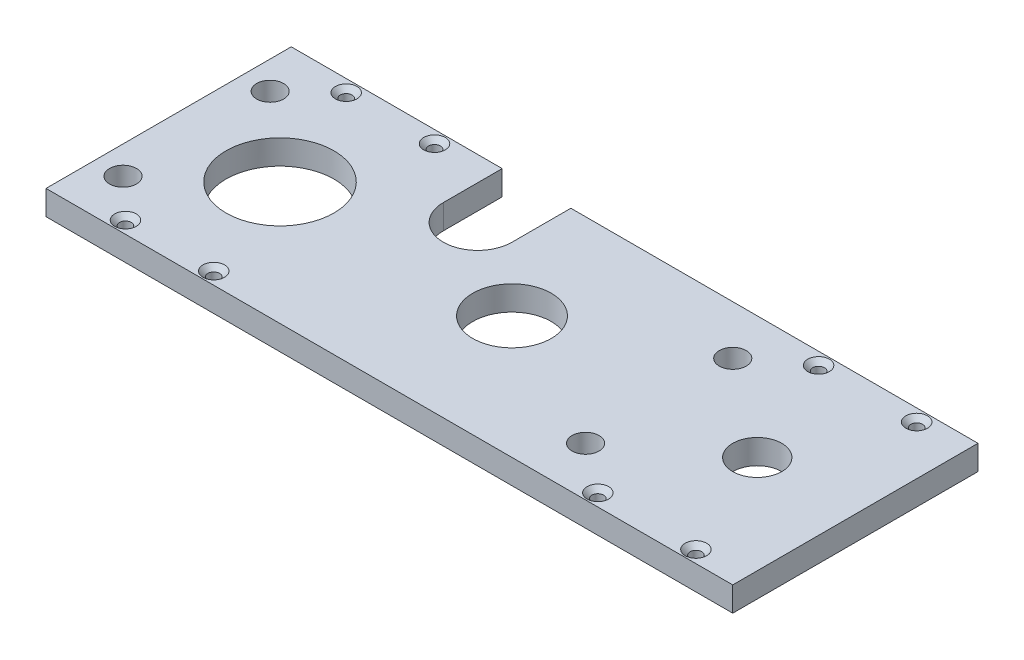
ISO-10303-21;
HEADER;
FILE_DESCRIPTION(('STEP AP214'),'2;1');
FILE_NAME('part.step','',(''),(''),'','','');
FILE_SCHEMA(('AUTOMOTIVE_DESIGN { 1 0 10303 214 1 1 1 1 }'));
ENDSEC;
DATA;
#1=APPLICATION_CONTEXT('core data for automotive mechanical design processes');
#2=APPLICATION_PROTOCOL_DEFINITION('international standard','automotive_design',2000,#1);
#3=PRODUCT_CONTEXT('',#1,'mechanical');
#4=PRODUCT('Part','Part','',(#3));
#5=PRODUCT_RELATED_PRODUCT_CATEGORY('part','',(#4));
#6=PRODUCT_DEFINITION_FORMATION('','',#4);
#7=PRODUCT_DEFINITION_CONTEXT('part definition',#1,'design');
#8=PRODUCT_DEFINITION('design','',#6,#7);
#9=PRODUCT_DEFINITION_SHAPE('','',#8);
#10=(LENGTH_UNIT() NAMED_UNIT(*) SI_UNIT(.MILLI.,.METRE.));
#11=(NAMED_UNIT(*) PLANE_ANGLE_UNIT() SI_UNIT($,.RADIAN.));
#12=(NAMED_UNIT(*) SI_UNIT($,.STERADIAN.) SOLID_ANGLE_UNIT());
#13=UNCERTAINTY_MEASURE_WITH_UNIT(LENGTH_MEASURE(1.E-05),#10,'distance_accuracy_value','');
#14=(GEOMETRIC_REPRESENTATION_CONTEXT(3) GLOBAL_UNCERTAINTY_ASSIGNED_CONTEXT((#13)) GLOBAL_UNIT_ASSIGNED_CONTEXT((#10,
#11,#12)) REPRESENTATION_CONTEXT('',''));
#15=CARTESIAN_POINT('',(0.,0.,0.));
#16=DIRECTION('',(0.,0.,1.));
#17=DIRECTION('',(1.,0.,0.));
#18=AXIS2_PLACEMENT_3D('',#15,#16,#17);
#19=CARTESIAN_POINT('',(-103.501932742673,5.,-25.));
#20=DIRECTION('',(0.,0.,1.));
#21=DIRECTION('',(1.,0.,0.));
#22=AXIS2_PLACEMENT_3D('',#19,#20,#21);
#23=PLANE('',#22);
#24=DIRECTION('',(-1.,0.,0.));
#25=VECTOR('',#24,1.);
#26=CARTESIAN_POINT('',(-103.501932742673,0.,-25.));
#27=LINE('',#26,#25);
#28=CARTESIAN_POINT('',(36.4980672573274,0.,-25.));
#29=VERTEX_POINT('',#28);
#30=CARTESIAN_POINT('',(-46.5019327426726,0.,-25.));
#31=VERTEX_POINT('',#30);
#32=EDGE_CURVE('E310',#29,#31,#27,.T.);
#33=ORIENTED_EDGE('',*,*,#32,.T.);
#34=DIRECTION('',(0.,-1.,0.));
#35=VECTOR('',#34,1.);
#36=CARTESIAN_POINT('',(-46.5019327426726,5.,-25.));
#37=LINE('',#36,#35);
#38=CARTESIAN_POINT('',(-46.5019327426726,5.,-25.));
#39=VERTEX_POINT('',#38);
#40=EDGE_CURVE('E150',#39,#31,#37,.T.);
#41=ORIENTED_EDGE('',*,*,#40,.F.);
#42=DIRECTION('',(-1.,0.,0.));
#43=VECTOR('',#42,1.);
#44=CARTESIAN_POINT('',(-103.501932742673,5.,-25.));
#45=LINE('',#44,#43);
#46=CARTESIAN_POINT('',(36.4980672573274,5.,-25.));
#47=VERTEX_POINT('',#46);
#48=EDGE_CURVE('E316',#47,#39,#45,.T.);
#49=ORIENTED_EDGE('',*,*,#48,.F.);
#50=DIRECTION('',(0.,-1.,0.));
#51=VECTOR('',#50,1.);
#52=CARTESIAN_POINT('',(36.4980672573274,5.,-25.));
#53=LINE('',#52,#51);
#54=EDGE_CURVE('E334',#47,#29,#53,.T.);
#55=ORIENTED_EDGE('',*,*,#54,.T.);
#56=EDGE_LOOP('',(#33,#41,#49,#55));
#57=FACE_BOUND('',#56,.T.);
#58=ADVANCED_FACE('F39',(#57),#23,.F.);
#59=CARTESIAN_POINT('',(0.,5.,0.));
#60=DIRECTION('',(0.,-1.,0.));
#61=DIRECTION('',(0.,0.,-1.));
#62=AXIS2_PLACEMENT_3D('',#59,#60,#61);
#63=PLANE('',#62);
#64=CARTESIAN_POINT('',(-97.8019327426726,5.,-15.));
#65=DIRECTION('',(0.,-1.,0.));
#66=DIRECTION('',(0.,0.,-1.));
#67=AXIS2_PLACEMENT_3D('',#64,#65,#66);
#68=CIRCLE('',#67,2.75);
#69=CARTESIAN_POINT('',(-97.8019327426726,5.,-17.75));
#70=VERTEX_POINT('',#69);
#71=EDGE_CURVE('E158',#70,#70,#68,.T.);
#72=ORIENTED_EDGE('',*,*,#71,.T.);
#73=EDGE_LOOP('',(#72));
#74=FACE_BOUND('',#73,.T.);
#75=CARTESIAN_POINT('',(-97.8019327426726,5.,15.));
#76=DIRECTION('',(0.,-1.,0.));
#77=DIRECTION('',(0.,0.,-1.));
#78=AXIS2_PLACEMENT_3D('',#75,#76,#77);
#79=CIRCLE('',#78,2.75);
#80=CARTESIAN_POINT('',(-97.8019327426726,5.,12.25));
#81=VERTEX_POINT('',#80);
#82=EDGE_CURVE('E166',#81,#81,#79,.T.);
#83=ORIENTED_EDGE('',*,*,#82,.T.);
#84=EDGE_LOOP('',(#83));
#85=FACE_BOUND('',#84,.T.);
#86=CARTESIAN_POINT('',(-3.50193274267263,5.,15.));
#87=DIRECTION('',(0.,-1.,0.));
#88=DIRECTION('',(0.,0.,-1.));
#89=AXIS2_PLACEMENT_3D('',#86,#87,#88);
#90=CIRCLE('',#89,2.75);
#91=CARTESIAN_POINT('',(-3.50193274267263,5.,12.25));
#92=VERTEX_POINT('',#91);
#93=EDGE_CURVE('E174',#92,#92,#90,.T.);
#94=ORIENTED_EDGE('',*,*,#93,.T.);
#95=EDGE_LOOP('',(#94));
#96=FACE_BOUND('',#95,.T.);
#97=CARTESIAN_POINT('',(-3.50193274267265,5.,-15.));
#98=DIRECTION('',(0.,-1.,0.));
#99=DIRECTION('',(0.,0.,-1.));
#100=AXIS2_PLACEMENT_3D('',#97,#98,#99);
#101=CIRCLE('',#100,2.75);
#102=CARTESIAN_POINT('',(-3.50193274267265,5.,-17.75));
#103=VERTEX_POINT('',#102);
#104=EDGE_CURVE('E182',#103,#103,#101,.T.);
#105=ORIENTED_EDGE('',*,*,#104,.T.);
#106=EDGE_LOOP('',(#105));
#107=FACE_BOUND('',#106,.T.);
#108=CARTESIAN_POINT('',(-71.8019327426726,5.,-22.5));
#109=DIRECTION('',(0.,1.,0.));
#110=DIRECTION('',(0.,0.,1.));
#111=AXIS2_PLACEMENT_3D('',#108,#109,#110);
#112=CIRCLE('',#111,2.19999999999999);
#113=CARTESIAN_POINT('',(-71.8019327426726,5.,-20.3));
#114=VERTEX_POINT('',#113);
#115=EDGE_CURVE('E198',#114,#114,#112,.T.);
#116=ORIENTED_EDGE('',*,*,#115,.F.);
#117=EDGE_LOOP('',(#116));
#118=FACE_BOUND('',#117,.T.);
#119=CARTESIAN_POINT('',(6.49806725732737,5.,22.5));
#120=DIRECTION('',(0.,1.,0.));
#121=DIRECTION('',(0.,0.,1.));
#122=AXIS2_PLACEMENT_3D('',#119,#120,#121);
#123=CIRCLE('',#122,2.2);
#124=CARTESIAN_POINT('',(6.49806725732737,5.,24.7));
#125=VERTEX_POINT('',#124);
#126=EDGE_CURVE('E258',#125,#125,#123,.T.);
#127=ORIENTED_EDGE('',*,*,#126,.F.);
#128=EDGE_LOOP('',(#127));
#129=FACE_BOUND('',#128,.T.);
#130=CARTESIAN_POINT('',(-80.8019327426726,5.,0.));
#131=DIRECTION('',(0.,1.,0.));
#132=DIRECTION('',(0.,0.,1.));
#133=AXIS2_PLACEMENT_3D('',#130,#131,#132);
#134=CIRCLE('',#133,11.);
#135=CARTESIAN_POINT('',(-80.8019327426726,5.,11.));
#136=VERTEX_POINT('',#135);
#137=EDGE_CURVE('E283',#136,#136,#134,.T.);
#138=ORIENTED_EDGE('',*,*,#137,.F.);
#139=EDGE_LOOP('',(#138));
#140=FACE_BOUND('',#139,.T.);
#141=CARTESIAN_POINT('',(-33.5019327426726,5.,0.));
#142=DIRECTION('',(0.,-1.,0.));
#143=DIRECTION('',(0.,0.,-1.));
#144=AXIS2_PLACEMENT_3D('',#141,#142,#143);
#145=CIRCLE('',#144,8.);
#146=CARTESIAN_POINT('',(-33.5019327426726,5.,-8.));
#147=VERTEX_POINT('',#146);
#148=EDGE_CURVE('E294',#147,#147,#145,.F.);
#149=ORIENTED_EDGE('',*,*,#148,.F.);
#150=EDGE_LOOP('',(#149));
#151=FACE_BOUND('',#150,.T.);
#152=ORIENTED_EDGE('',*,*,#48,.T.);
#153=DIRECTION('',(0.,0.,1.));
#154=VECTOR('',#153,1.);
#155=CARTESIAN_POINT('',(-46.5019327426726,5.,-13.));
#156=LINE('',#155,#154);
#157=CARTESIAN_POINT('',(-46.5019327426726,5.,-13.));
#158=VERTEX_POINT('',#157);
#159=EDGE_CURVE('E124',#39,#158,#156,.T.);
#160=ORIENTED_EDGE('',*,*,#159,.T.);
#161=CARTESIAN_POINT('',(-53.5019327426726,5.,-13.));
#162=DIRECTION('',(0.,-1.,0.));
#163=DIRECTION('',(0.,0.,-1.));
#164=AXIS2_PLACEMENT_3D('',#161,#162,#163);
#165=CIRCLE('',#164,7.);
#166=CARTESIAN_POINT('',(-60.5019327426726,5.,-13.));
#167=VERTEX_POINT('',#166);
#168=EDGE_CURVE('E118',#158,#167,#165,.T.);
#169=ORIENTED_EDGE('',*,*,#168,.T.);
#170=DIRECTION('',(0.,0.,-1.));
#171=VECTOR('',#170,1.);
#172=CARTESIAN_POINT('',(-60.5019327426726,5.,-13.));
#173=LINE('',#172,#171);
#174=CARTESIAN_POINT('',(-60.5019327426726,5.,-25.));
#175=VERTEX_POINT('',#174);
#176=EDGE_CURVE('E126',#167,#175,#173,.T.);
#177=ORIENTED_EDGE('',*,*,#176,.T.);
#178=CARTESIAN_POINT('',(-103.501932742673,5.,-25.));
#179=VERTEX_POINT('',#178);
#180=EDGE_CURVE('E64',#175,#179,#45,.T.);
#181=ORIENTED_EDGE('',*,*,#180,.T.);
#182=DIRECTION('',(0.,0.,1.));
#183=VECTOR('',#182,1.);
#184=CARTESIAN_POINT('',(-103.501932742673,5.,25.));
#185=LINE('',#184,#183);
#186=CARTESIAN_POINT('',(-103.501932742673,5.,25.));
#187=VERTEX_POINT('',#186);
#188=EDGE_CURVE('E307',#179,#187,#185,.T.);
#189=ORIENTED_EDGE('',*,*,#188,.T.);
#190=DIRECTION('',(1.,0.,0.));
#191=VECTOR('',#190,1.);
#192=CARTESIAN_POINT('',(36.4980672573274,5.,25.));
#193=LINE('',#192,#191);
#194=CARTESIAN_POINT('',(36.4980672573274,5.,25.));
#195=VERTEX_POINT('',#194);
#196=EDGE_CURVE('E92',#187,#195,#193,.T.);
#197=ORIENTED_EDGE('',*,*,#196,.T.);
#198=DIRECTION('',(0.,0.,-1.));
#199=VECTOR('',#198,1.);
#200=CARTESIAN_POINT('',(36.4980672573274,5.,25.));
#201=LINE('',#200,#199);
#202=EDGE_CURVE('E313',#195,#47,#201,.T.);
#203=ORIENTED_EDGE('',*,*,#202,.T.);
#204=EDGE_LOOP('',(#152,#160,#169,#177,#181,#189,#197,#203));
#205=FACE_BOUND('',#204,.T.);
#206=CARTESIAN_POINT('',(16.4980672573274,5.,0.));
#207=DIRECTION('',(0.,1.,0.));
#208=DIRECTION('',(0.,0.,1.));
#209=AXIS2_PLACEMENT_3D('',#206,#207,#208);
#210=CIRCLE('',#209,5.);
#211=CARTESIAN_POINT('',(16.4980672573274,5.,4.99999999999999));
#212=VERTEX_POINT('',#211);
#213=EDGE_CURVE('E299',#212,#212,#210,.T.);
#214=ORIENTED_EDGE('',*,*,#213,.F.);
#215=EDGE_LOOP('',(#214));
#216=FACE_BOUND('',#215,.T.);
#217=CARTESIAN_POINT('',(26.4980672573274,5.,22.5));
#218=DIRECTION('',(0.,1.,0.));
#219=DIRECTION('',(0.,0.,1.));
#220=AXIS2_PLACEMENT_3D('',#217,#218,#219);
#221=CIRCLE('',#220,2.2);
#222=CARTESIAN_POINT('',(26.4980672573274,5.,24.7));
#223=VERTEX_POINT('',#222);
#224=EDGE_CURVE('E270',#223,#223,#221,.T.);
#225=ORIENTED_EDGE('',*,*,#224,.F.);
#226=EDGE_LOOP('',(#225));
#227=FACE_BOUND('',#226,.T.);
#228=CARTESIAN_POINT('',(26.4980672573274,5.,-22.5));
#229=DIRECTION('',(0.,1.,0.));
#230=DIRECTION('',(0.,0.,1.));
#231=AXIS2_PLACEMENT_3D('',#228,#229,#230);
#232=CIRCLE('',#231,2.2);
#233=CARTESIAN_POINT('',(26.4980672573274,5.,-20.3));
#234=VERTEX_POINT('',#233);
#235=EDGE_CURVE('E246',#234,#234,#232,.T.);
#236=ORIENTED_EDGE('',*,*,#235,.F.);
#237=EDGE_LOOP('',(#236));
#238=FACE_BOUND('',#237,.T.);
#239=CARTESIAN_POINT('',(6.49806725732737,5.,-22.5));
#240=DIRECTION('',(0.,1.,0.));
#241=DIRECTION('',(0.,0.,1.));
#242=AXIS2_PLACEMENT_3D('',#239,#240,#241);
#243=CIRCLE('',#242,2.2);
#244=CARTESIAN_POINT('',(6.49806725732737,5.,-20.3));
#245=VERTEX_POINT('',#244);
#246=EDGE_CURVE('E234',#245,#245,#243,.T.);
#247=ORIENTED_EDGE('',*,*,#246,.F.);
#248=EDGE_LOOP('',(#247));
#249=FACE_BOUND('',#248,.T.);
#250=CARTESIAN_POINT('',(-89.8019327426726,5.,22.5));
#251=DIRECTION('',(0.,1.,0.));
#252=DIRECTION('',(0.,0.,1.));
#253=AXIS2_PLACEMENT_3D('',#250,#251,#252);
#254=CIRCLE('',#253,2.19999999999999);
#255=CARTESIAN_POINT('',(-89.8019327426726,5.,24.7));
#256=VERTEX_POINT('',#255);
#257=EDGE_CURVE('E222',#256,#256,#254,.T.);
#258=ORIENTED_EDGE('',*,*,#257,.F.);
#259=EDGE_LOOP('',(#258));
#260=FACE_BOUND('',#259,.T.);
#261=CARTESIAN_POINT('',(-71.8019327426726,5.,22.5));
#262=DIRECTION('',(0.,1.,0.));
#263=DIRECTION('',(0.,0.,1.));
#264=AXIS2_PLACEMENT_3D('',#261,#262,#263);
#265=CIRCLE('',#264,2.19999999999999);
#266=CARTESIAN_POINT('',(-71.8019327426726,5.,24.7));
#267=VERTEX_POINT('',#266);
#268=EDGE_CURVE('E210',#267,#267,#265,.T.);
#269=ORIENTED_EDGE('',*,*,#268,.F.);
#270=EDGE_LOOP('',(#269));
#271=FACE_BOUND('',#270,.T.);
#272=CARTESIAN_POINT('',(-89.8019327426726,5.,-22.5));
#273=DIRECTION('',(0.,1.,0.));
#274=DIRECTION('',(0.,0.,1.));
#275=AXIS2_PLACEMENT_3D('',#272,#273,#274);
#276=CIRCLE('',#275,2.19999999999999);
#277=CARTESIAN_POINT('',(-89.8019327426726,5.,-20.3));
#278=VERTEX_POINT('',#277);
#279=EDGE_CURVE('E186',#278,#278,#276,.T.);
#280=ORIENTED_EDGE('',*,*,#279,.F.);
#281=EDGE_LOOP('',(#280));
#282=FACE_BOUND('',#281,.T.);
#283=ADVANCED_FACE('F131',(#74,#85,#96,#107,#118,#129,#140,#151,#205,#216,#227,#238,#249,#260,
#271,#282),#63,.F.);
#284=CARTESIAN_POINT('',(0.,0.,0.));
#285=DIRECTION('',(0.,-1.,0.));
#286=DIRECTION('',(0.,0.,-1.));
#287=AXIS2_PLACEMENT_3D('',#284,#285,#286);
#288=PLANE('',#287);
#289=DIRECTION('',(0.,0.,1.));
#290=VECTOR('',#289,1.);
#291=CARTESIAN_POINT('',(-46.5019327426726,0.,-13.));
#292=LINE('',#291,#290);
#293=CARTESIAN_POINT('',(-46.5019327426726,0.,-13.));
#294=VERTEX_POINT('',#293);
#295=EDGE_CURVE('E134',#31,#294,#292,.T.);
#296=ORIENTED_EDGE('',*,*,#295,.F.);
#297=ORIENTED_EDGE('',*,*,#32,.F.);
#298=DIRECTION('',(0.,0.,-1.));
#299=VECTOR('',#298,1.);
#300=CARTESIAN_POINT('',(36.4980672573274,0.,25.));
#301=LINE('',#300,#299);
#302=CARTESIAN_POINT('',(36.4980672573274,0.,25.));
#303=VERTEX_POINT('',#302);
#304=EDGE_CURVE('E326',#303,#29,#301,.T.);
#305=ORIENTED_EDGE('',*,*,#304,.F.);
#306=DIRECTION('',(1.,0.,0.));
#307=VECTOR('',#306,1.);
#308=CARTESIAN_POINT('',(36.4980672573274,0.,25.));
#309=LINE('',#308,#307);
#310=CARTESIAN_POINT('',(-103.501932742673,0.,25.));
#311=VERTEX_POINT('',#310);
#312=EDGE_CURVE('E323',#311,#303,#309,.T.);
#313=ORIENTED_EDGE('',*,*,#312,.F.);
#314=DIRECTION('',(0.,0.,1.));
#315=VECTOR('',#314,1.);
#316=CARTESIAN_POINT('',(-103.501932742673,0.,25.));
#317=LINE('',#316,#315);
#318=CARTESIAN_POINT('',(-103.501932742673,0.,-25.));
#319=VERTEX_POINT('',#318);
#320=EDGE_CURVE('E303',#319,#311,#317,.T.);
#321=ORIENTED_EDGE('',*,*,#320,.F.);
#322=CARTESIAN_POINT('',(-60.5019327426726,0.,-25.));
#323=VERTEX_POINT('',#322);
#324=EDGE_CURVE('E85',#323,#319,#27,.T.);
#325=ORIENTED_EDGE('',*,*,#324,.F.);
#326=DIRECTION('',(0.,0.,-1.));
#327=VECTOR('',#326,1.);
#328=CARTESIAN_POINT('',(-60.5019327426726,0.,-13.));
#329=LINE('',#328,#327);
#330=CARTESIAN_POINT('',(-60.5019327426726,0.,-13.));
#331=VERTEX_POINT('',#330);
#332=EDGE_CURVE('E55',#331,#323,#329,.T.);
#333=ORIENTED_EDGE('',*,*,#332,.F.);
#334=CARTESIAN_POINT('',(-53.5019327426726,0.,-13.));
#335=DIRECTION('',(0.,-1.,0.));
#336=DIRECTION('',(0.,0.,-1.));
#337=AXIS2_PLACEMENT_3D('',#334,#335,#336);
#338=CIRCLE('',#337,7.);
#339=EDGE_CURVE('E121',#294,#331,#338,.T.);
#340=ORIENTED_EDGE('',*,*,#339,.F.);
#341=EDGE_LOOP('',(#296,#297,#305,#313,#321,#325,#333,#340));
#342=FACE_BOUND('',#341,.T.);
#343=CARTESIAN_POINT('',(-97.8019327426726,0.,-15.));
#344=DIRECTION('',(0.,-1.,0.));
#345=DIRECTION('',(0.,0.,-1.));
#346=AXIS2_PLACEMENT_3D('',#343,#344,#345);
#347=CIRCLE('',#346,2.75);
#348=CARTESIAN_POINT('',(-97.8019327426726,0.,-17.75));
#349=VERTEX_POINT('',#348);
#350=EDGE_CURVE('E149',#349,#349,#347,.T.);
#351=ORIENTED_EDGE('',*,*,#350,.F.);
#352=EDGE_LOOP('',(#351));
#353=FACE_BOUND('',#352,.T.);
#354=CARTESIAN_POINT('',(-97.8019327426726,0.,15.));
#355=DIRECTION('',(0.,-1.,0.));
#356=DIRECTION('',(0.,0.,-1.));
#357=AXIS2_PLACEMENT_3D('',#354,#355,#356);
#358=CIRCLE('',#357,2.75);
#359=CARTESIAN_POINT('',(-97.8019327426726,0.,12.25));
#360=VERTEX_POINT('',#359);
#361=EDGE_CURVE('E162',#360,#360,#358,.T.);
#362=ORIENTED_EDGE('',*,*,#361,.F.);
#363=EDGE_LOOP('',(#362));
#364=FACE_BOUND('',#363,.T.);
#365=CARTESIAN_POINT('',(-3.50193274267263,0.,15.));
#366=DIRECTION('',(0.,-1.,0.));
#367=DIRECTION('',(0.,0.,-1.));
#368=AXIS2_PLACEMENT_3D('',#365,#366,#367);
#369=CIRCLE('',#368,2.75);
#370=CARTESIAN_POINT('',(-3.50193274267263,0.,12.25));
#371=VERTEX_POINT('',#370);
#372=EDGE_CURVE('E170',#371,#371,#369,.T.);
#373=ORIENTED_EDGE('',*,*,#372,.F.);
#374=EDGE_LOOP('',(#373));
#375=FACE_BOUND('',#374,.T.);
#376=CARTESIAN_POINT('',(-3.50193274267265,0.,-15.));
#377=DIRECTION('',(0.,-1.,0.));
#378=DIRECTION('',(0.,0.,-1.));
#379=AXIS2_PLACEMENT_3D('',#376,#377,#378);
#380=CIRCLE('',#379,2.75);
#381=CARTESIAN_POINT('',(-3.50193274267265,0.,-17.75));
#382=VERTEX_POINT('',#381);
#383=EDGE_CURVE('E178',#382,#382,#380,.T.);
#384=ORIENTED_EDGE('',*,*,#383,.F.);
#385=EDGE_LOOP('',(#384));
#386=FACE_BOUND('',#385,.T.);
#387=CARTESIAN_POINT('',(-89.8019327426726,0.,-22.5));
#388=DIRECTION('',(0.,-1.,0.));
#389=DIRECTION('',(0.,0.,-1.));
#390=AXIS2_PLACEMENT_3D('',#387,#388,#389);
#391=CIRCLE('',#390,1.19999999999999);
#392=CARTESIAN_POINT('',(-89.8019327426726,0.,-23.7));
#393=VERTEX_POINT('',#392);
#394=EDGE_CURVE('E194',#393,#393,#391,.T.);
#395=ORIENTED_EDGE('',*,*,#394,.F.);
#396=EDGE_LOOP('',(#395));
#397=FACE_BOUND('',#396,.T.);
#398=CARTESIAN_POINT('',(-71.8019327426726,0.,-22.5));
#399=DIRECTION('',(0.,-1.,0.));
#400=DIRECTION('',(0.,0.,-1.));
#401=AXIS2_PLACEMENT_3D('',#398,#399,#400);
#402=CIRCLE('',#401,1.19999999999999);
#403=CARTESIAN_POINT('',(-71.8019327426726,0.,-23.7));
#404=VERTEX_POINT('',#403);
#405=EDGE_CURVE('E206',#404,#404,#402,.T.);
#406=ORIENTED_EDGE('',*,*,#405,.F.);
#407=EDGE_LOOP('',(#406));
#408=FACE_BOUND('',#407,.T.);
#409=CARTESIAN_POINT('',(-71.8019327426726,0.,22.5));
#410=DIRECTION('',(0.,-1.,0.));
#411=DIRECTION('',(0.,0.,-1.));
#412=AXIS2_PLACEMENT_3D('',#409,#410,#411);
#413=CIRCLE('',#412,1.19999999999999);
#414=CARTESIAN_POINT('',(-71.8019327426726,0.,21.3));
#415=VERTEX_POINT('',#414);
#416=EDGE_CURVE('E218',#415,#415,#413,.T.);
#417=ORIENTED_EDGE('',*,*,#416,.F.);
#418=EDGE_LOOP('',(#417));
#419=FACE_BOUND('',#418,.T.);
#420=CARTESIAN_POINT('',(-89.8019327426726,0.,22.5));
#421=DIRECTION('',(0.,-1.,0.));
#422=DIRECTION('',(0.,0.,-1.));
#423=AXIS2_PLACEMENT_3D('',#420,#421,#422);
#424=CIRCLE('',#423,1.19999999999999);
#425=CARTESIAN_POINT('',(-89.8019327426726,0.,21.3));
#426=VERTEX_POINT('',#425);
#427=EDGE_CURVE('E230',#426,#426,#424,.T.);
#428=ORIENTED_EDGE('',*,*,#427,.F.);
#429=EDGE_LOOP('',(#428));
#430=FACE_BOUND('',#429,.T.);
#431=CARTESIAN_POINT('',(6.49806725732737,0.,-22.5));
#432=DIRECTION('',(0.,-1.,0.));
#433=DIRECTION('',(0.,0.,-1.));
#434=AXIS2_PLACEMENT_3D('',#431,#432,#433);
#435=CIRCLE('',#434,1.2);
#436=CARTESIAN_POINT('',(6.49806725732737,0.,-23.7));
#437=VERTEX_POINT('',#436);
#438=EDGE_CURVE('E242',#437,#437,#435,.T.);
#439=ORIENTED_EDGE('',*,*,#438,.F.);
#440=EDGE_LOOP('',(#439));
#441=FACE_BOUND('',#440,.T.);
#442=CARTESIAN_POINT('',(26.4980672573274,0.,-22.5));
#443=DIRECTION('',(0.,-1.,0.));
#444=DIRECTION('',(0.,0.,-1.));
#445=AXIS2_PLACEMENT_3D('',#442,#443,#444);
#446=CIRCLE('',#445,1.2);
#447=CARTESIAN_POINT('',(26.4980672573274,0.,-23.7));
#448=VERTEX_POINT('',#447);
#449=EDGE_CURVE('E254',#448,#448,#446,.T.);
#450=ORIENTED_EDGE('',*,*,#449,.F.);
#451=EDGE_LOOP('',(#450));
#452=FACE_BOUND('',#451,.T.);
#453=CARTESIAN_POINT('',(6.49806725732737,0.,22.5));
#454=DIRECTION('',(0.,-1.,0.));
#455=DIRECTION('',(0.,0.,-1.));
#456=AXIS2_PLACEMENT_3D('',#453,#454,#455);
#457=CIRCLE('',#456,1.2);
#458=CARTESIAN_POINT('',(6.49806725732737,0.,21.3));
#459=VERTEX_POINT('',#458);
#460=EDGE_CURVE('E266',#459,#459,#457,.T.);
#461=ORIENTED_EDGE('',*,*,#460,.F.);
#462=EDGE_LOOP('',(#461));
#463=FACE_BOUND('',#462,.T.);
#464=CARTESIAN_POINT('',(26.4980672573274,0.,22.5));
#465=DIRECTION('',(0.,-1.,0.));
#466=DIRECTION('',(0.,0.,-1.));
#467=AXIS2_PLACEMENT_3D('',#464,#465,#466);
#468=CIRCLE('',#467,1.2);
#469=CARTESIAN_POINT('',(26.4980672573274,0.,21.3));
#470=VERTEX_POINT('',#469);
#471=EDGE_CURVE('E278',#470,#470,#468,.T.);
#472=ORIENTED_EDGE('',*,*,#471,.F.);
#473=EDGE_LOOP('',(#472));
#474=FACE_BOUND('',#473,.T.);
#475=CARTESIAN_POINT('',(-80.8019327426726,0.,0.));
#476=DIRECTION('',(0.,-1.,0.));
#477=DIRECTION('',(0.,0.,-1.));
#478=AXIS2_PLACEMENT_3D('',#475,#476,#477);
#479=CIRCLE('',#478,11.);
#480=CARTESIAN_POINT('',(-80.8019327426726,0.,-11.));
#481=VERTEX_POINT('',#480);
#482=EDGE_CURVE('E282',#481,#481,#479,.F.);
#483=ORIENTED_EDGE('',*,*,#482,.T.);
#484=EDGE_LOOP('',(#483));
#485=FACE_BOUND('',#484,.T.);
#486=CARTESIAN_POINT('',(-33.5019327426726,0.,0.));
#487=DIRECTION('',(0.,-1.,0.));
#488=DIRECTION('',(0.,0.,-1.));
#489=AXIS2_PLACEMENT_3D('',#486,#487,#488);
#490=CIRCLE('',#489,8.);
#491=CARTESIAN_POINT('',(-33.5019327426726,0.,-8.));
#492=VERTEX_POINT('',#491);
#493=EDGE_CURVE('E287',#492,#492,#490,.T.);
#494=ORIENTED_EDGE('',*,*,#493,.F.);
#495=EDGE_LOOP('',(#494));
#496=FACE_BOUND('',#495,.T.);
#497=CARTESIAN_POINT('',(16.4980672573274,0.,0.));
#498=DIRECTION('',(0.,1.,0.));
#499=DIRECTION('',(0.,0.,1.));
#500=AXIS2_PLACEMENT_3D('',#497,#498,#499);
#501=CIRCLE('',#500,5.);
#502=CARTESIAN_POINT('',(16.4980672573274,0.,4.99999999999999));
#503=VERTEX_POINT('',#502);
#504=EDGE_CURVE('E298',#503,#503,#501,.T.);
#505=ORIENTED_EDGE('',*,*,#504,.T.);
#506=EDGE_LOOP('',(#505));
#507=FACE_BOUND('',#506,.T.);
#508=ADVANCED_FACE('F347',(#342,#353,#364,#375,#386,#397,#408,#419,#430,#441,#452,#463,#474,
#485,#496,#507),#288,.T.);
#509=CARTESIAN_POINT('',(-103.501932742673,5.,25.));
#510=DIRECTION('',(1.,0.,0.));
#511=DIRECTION('',(0.,0.,-1.));
#512=AXIS2_PLACEMENT_3D('',#509,#510,#511);
#513=PLANE('',#512);
#514=ORIENTED_EDGE('',*,*,#320,.T.);
#515=DIRECTION('',(0.,-1.,0.));
#516=VECTOR('',#515,1.);
#517=CARTESIAN_POINT('',(-103.501932742673,5.,25.));
#518=LINE('',#517,#516);
#519=EDGE_CURVE('E11',#187,#311,#518,.T.);
#520=ORIENTED_EDGE('',*,*,#519,.F.);
#521=ORIENTED_EDGE('',*,*,#188,.F.);
#522=DIRECTION('',(0.,-1.,0.));
#523=VECTOR('',#522,1.);
#524=CARTESIAN_POINT('',(-103.501932742673,5.,-25.));
#525=LINE('',#524,#523);
#526=EDGE_CURVE('E319',#179,#319,#525,.T.);
#527=ORIENTED_EDGE('',*,*,#526,.T.);
#528=EDGE_LOOP('',(#514,#520,#521,#527));
#529=FACE_BOUND('',#528,.T.);
#530=ADVANCED_FACE('F41',(#529),#513,.F.);
#531=CARTESIAN_POINT('',(36.4980672573274,5.,25.));
#532=DIRECTION('',(0.,0.,-1.));
#533=DIRECTION('',(-1.,0.,0.));
#534=AXIS2_PLACEMENT_3D('',#531,#532,#533);
#535=PLANE('',#534);
#536=ORIENTED_EDGE('',*,*,#312,.T.);
#537=DIRECTION('',(0.,-1.,0.));
#538=VECTOR('',#537,1.);
#539=CARTESIAN_POINT('',(36.4980672573274,5.,25.));
#540=LINE('',#539,#538);
#541=EDGE_CURVE('E48',#195,#303,#540,.T.);
#542=ORIENTED_EDGE('',*,*,#541,.F.);
#543=ORIENTED_EDGE('',*,*,#196,.F.);
#544=ORIENTED_EDGE('',*,*,#519,.T.);
#545=EDGE_LOOP('',(#536,#542,#543,#544));
#546=FACE_BOUND('',#545,.T.);
#547=ADVANCED_FACE('F356',(#546),#535,.F.);
#548=CARTESIAN_POINT('',(36.4980672573274,5.,25.));
#549=DIRECTION('',(-1.,0.,0.));
#550=DIRECTION('',(0.,0.,1.));
#551=AXIS2_PLACEMENT_3D('',#548,#549,#550);
#552=PLANE('',#551);
#553=ORIENTED_EDGE('',*,*,#304,.T.);
#554=ORIENTED_EDGE('',*,*,#54,.F.);
#555=ORIENTED_EDGE('',*,*,#202,.F.);
#556=ORIENTED_EDGE('',*,*,#541,.T.);
#557=EDGE_LOOP('',(#553,#554,#555,#556));
#558=FACE_BOUND('',#557,.T.);
#559=ADVANCED_FACE('F342',(#558),#552,.F.);
#560=ORIENTED_EDGE('',*,*,#180,.F.);
#561=DIRECTION('',(0.,-1.,0.));
#562=VECTOR('',#561,1.);
#563=CARTESIAN_POINT('',(-60.5019327426726,5.,-25.));
#564=LINE('',#563,#562);
#565=EDGE_CURVE('E123',#175,#323,#564,.T.);
#566=ORIENTED_EDGE('',*,*,#565,.T.);
#567=ORIENTED_EDGE('',*,*,#324,.T.);
#568=ORIENTED_EDGE('',*,*,#526,.F.);
#569=EDGE_LOOP('',(#560,#566,#567,#568));
#570=FACE_BOUND('',#569,.T.);
#571=ADVANCED_FACE('F362',(#570),#23,.F.);
#572=CARTESIAN_POINT('',(16.4980672573274,5.,0.));
#573=DIRECTION('',(0.,-1.,0.));
#574=DIRECTION('',(0.,0.,-1.));
#575=AXIS2_PLACEMENT_3D('',#572,#573,#574);
#576=CYLINDRICAL_SURFACE('',#575,5.);
#577=ORIENTED_EDGE('',*,*,#213,.T.);
#578=EDGE_LOOP('',(#577));
#579=FACE_BOUND('',#578,.T.);
#580=ORIENTED_EDGE('',*,*,#504,.F.);
#581=EDGE_LOOP('',(#580));
#582=FACE_BOUND('',#581,.T.);
#583=ADVANCED_FACE('F373',(#579,#582),#576,.F.);
#584=CARTESIAN_POINT('',(-33.5019327426726,5.001,0.));
#585=DIRECTION('',(0.,-1.,0.));
#586=DIRECTION('',(0.,0.,-1.));
#587=AXIS2_PLACEMENT_3D('',#584,#585,#586);
#588=CYLINDRICAL_SURFACE('',#587,8.);
#589=ORIENTED_EDGE('',*,*,#493,.T.);
#590=EDGE_LOOP('',(#589));
#591=FACE_BOUND('',#590,.T.);
#592=ORIENTED_EDGE('',*,*,#148,.T.);
#593=EDGE_LOOP('',(#592));
#594=FACE_BOUND('',#593,.T.);
#595=ADVANCED_FACE('F377',(#591,#594),#588,.F.);
#596=CARTESIAN_POINT('',(-80.8019327426726,-0.00100000000000013,0.));
#597=DIRECTION('',(0.,1.,0.));
#598=DIRECTION('',(0.,0.,1.));
#599=AXIS2_PLACEMENT_3D('',#596,#597,#598);
#600=CYLINDRICAL_SURFACE('',#599,11.);
#601=ORIENTED_EDGE('',*,*,#482,.F.);
#602=EDGE_LOOP('',(#601));
#603=FACE_BOUND('',#602,.T.);
#604=ORIENTED_EDGE('',*,*,#137,.T.);
#605=EDGE_LOOP('',(#604));
#606=FACE_BOUND('',#605,.T.);
#607=ADVANCED_FACE('F385',(#603,#606),#600,.F.);
#608=CARTESIAN_POINT('',(26.4980672573274,5.,22.5));
#609=DIRECTION('',(0.,1.,0.));
#610=DIRECTION('',(0.,0.,1.));
#611=AXIS2_PLACEMENT_3D('',#608,#609,#610);
#612=CYLINDRICAL_SURFACE('',#611,1.2);
#613=CARTESIAN_POINT('',(26.4980672573274,4.,22.5));
#614=DIRECTION('',(0.,1.,0.));
#615=DIRECTION('',(0.,0.,1.));
#616=AXIS2_PLACEMENT_3D('',#613,#614,#615);
#617=CIRCLE('',#616,1.2);
#618=CARTESIAN_POINT('',(26.4980672573274,4.,23.7));
#619=VERTEX_POINT('',#618);
#620=EDGE_CURVE('E274',#619,#619,#617,.T.);
#621=ORIENTED_EDGE('',*,*,#620,.T.);
#622=EDGE_LOOP('',(#621));
#623=FACE_BOUND('',#622,.T.);
#624=ORIENTED_EDGE('',*,*,#471,.T.);
#625=EDGE_LOOP('',(#624));
#626=FACE_BOUND('',#625,.T.);
#627=ADVANCED_FACE('F429',(#623,#626),#612,.F.);
#628=CARTESIAN_POINT('',(26.4980672573274,5.,22.5));
#629=DIRECTION('',(0.,1.,0.));
#630=DIRECTION('',(0.,0.,1.));
#631=AXIS2_PLACEMENT_3D('',#628,#629,#630);
#632=CONICAL_SURFACE('',#631,2.2,0.785398163397447);
#633=ORIENTED_EDGE('',*,*,#620,.F.);
#634=EDGE_LOOP('',(#633));
#635=FACE_BOUND('',#634,.T.);
#636=ORIENTED_EDGE('',*,*,#224,.T.);
#637=EDGE_LOOP('',(#636));
#638=FACE_BOUND('',#637,.T.);
#639=ADVANCED_FACE('F439',(#635,#638),#632,.F.);
#640=CARTESIAN_POINT('',(6.49806725732737,5.,22.5));
#641=DIRECTION('',(0.,1.,0.));
#642=DIRECTION('',(0.,0.,1.));
#643=AXIS2_PLACEMENT_3D('',#640,#641,#642);
#644=CYLINDRICAL_SURFACE('',#643,1.2);
#645=CARTESIAN_POINT('',(6.49806725732737,4.,22.5));
#646=DIRECTION('',(0.,1.,0.));
#647=DIRECTION('',(0.,0.,1.));
#648=AXIS2_PLACEMENT_3D('',#645,#646,#647);
#649=CIRCLE('',#648,1.2);
#650=CARTESIAN_POINT('',(6.49806725732737,4.,23.7));
#651=VERTEX_POINT('',#650);
#652=EDGE_CURVE('E262',#651,#651,#649,.T.);
#653=ORIENTED_EDGE('',*,*,#652,.T.);
#654=EDGE_LOOP('',(#653));
#655=FACE_BOUND('',#654,.T.);
#656=ORIENTED_EDGE('',*,*,#460,.T.);
#657=EDGE_LOOP('',(#656));
#658=FACE_BOUND('',#657,.T.);
#659=ADVANCED_FACE('F449',(#655,#658),#644,.F.);
#660=CARTESIAN_POINT('',(6.49806725732737,5.,22.5));
#661=DIRECTION('',(0.,1.,0.));
#662=DIRECTION('',(0.,0.,1.));
#663=AXIS2_PLACEMENT_3D('',#660,#661,#662);
#664=CONICAL_SURFACE('',#663,2.2,0.785398163397448);
#665=ORIENTED_EDGE('',*,*,#652,.F.);
#666=EDGE_LOOP('',(#665));
#667=FACE_BOUND('',#666,.T.);
#668=ORIENTED_EDGE('',*,*,#126,.T.);
#669=EDGE_LOOP('',(#668));
#670=FACE_BOUND('',#669,.T.);
#671=ADVANCED_FACE('F459',(#667,#670),#664,.F.);
#672=CARTESIAN_POINT('',(26.4980672573274,5.,-22.5));
#673=DIRECTION('',(0.,1.,0.));
#674=DIRECTION('',(0.,0.,1.));
#675=AXIS2_PLACEMENT_3D('',#672,#673,#674);
#676=CYLINDRICAL_SURFACE('',#675,1.2);
#677=CARTESIAN_POINT('',(26.4980672573274,4.,-22.5));
#678=DIRECTION('',(0.,1.,0.));
#679=DIRECTION('',(0.,0.,1.));
#680=AXIS2_PLACEMENT_3D('',#677,#678,#679);
#681=CIRCLE('',#680,1.2);
#682=CARTESIAN_POINT('',(26.4980672573274,4.,-21.3));
#683=VERTEX_POINT('',#682);
#684=EDGE_CURVE('E250',#683,#683,#681,.T.);
#685=ORIENTED_EDGE('',*,*,#684,.T.);
#686=EDGE_LOOP('',(#685));
#687=FACE_BOUND('',#686,.T.);
#688=ORIENTED_EDGE('',*,*,#449,.T.);
#689=EDGE_LOOP('',(#688));
#690=FACE_BOUND('',#689,.T.);
#691=ADVANCED_FACE('F469',(#687,#690),#676,.F.);
#692=CARTESIAN_POINT('',(26.4980672573274,5.,-22.5));
#693=DIRECTION('',(0.,1.,0.));
#694=DIRECTION('',(0.,0.,1.));
#695=AXIS2_PLACEMENT_3D('',#692,#693,#694);
#696=CONICAL_SURFACE('',#695,2.2,0.785398163397447);
#697=ORIENTED_EDGE('',*,*,#684,.F.);
#698=EDGE_LOOP('',(#697));
#699=FACE_BOUND('',#698,.T.);
#700=ORIENTED_EDGE('',*,*,#235,.T.);
#701=EDGE_LOOP('',(#700));
#702=FACE_BOUND('',#701,.T.);
#703=ADVANCED_FACE('F479',(#699,#702),#696,.F.);
#704=CARTESIAN_POINT('',(6.49806725732737,5.,-22.5));
#705=DIRECTION('',(0.,1.,0.));
#706=DIRECTION('',(0.,0.,1.));
#707=AXIS2_PLACEMENT_3D('',#704,#705,#706);
#708=CYLINDRICAL_SURFACE('',#707,1.2);
#709=CARTESIAN_POINT('',(6.49806725732737,4.,-22.5));
#710=DIRECTION('',(0.,1.,0.));
#711=DIRECTION('',(0.,0.,1.));
#712=AXIS2_PLACEMENT_3D('',#709,#710,#711);
#713=CIRCLE('',#712,1.2);
#714=CARTESIAN_POINT('',(6.49806725732737,4.,-21.3));
#715=VERTEX_POINT('',#714);
#716=EDGE_CURVE('E238',#715,#715,#713,.T.);
#717=ORIENTED_EDGE('',*,*,#716,.T.);
#718=EDGE_LOOP('',(#717));
#719=FACE_BOUND('',#718,.T.);
#720=ORIENTED_EDGE('',*,*,#438,.T.);
#721=EDGE_LOOP('',(#720));
#722=FACE_BOUND('',#721,.T.);
#723=ADVANCED_FACE('F489',(#719,#722),#708,.F.);
#724=CARTESIAN_POINT('',(6.49806725732737,5.,-22.5));
#725=DIRECTION('',(0.,1.,0.));
#726=DIRECTION('',(0.,0.,1.));
#727=AXIS2_PLACEMENT_3D('',#724,#725,#726);
#728=CONICAL_SURFACE('',#727,2.2,0.785398163397448);
#729=ORIENTED_EDGE('',*,*,#716,.F.);
#730=EDGE_LOOP('',(#729));
#731=FACE_BOUND('',#730,.T.);
#732=ORIENTED_EDGE('',*,*,#246,.T.);
#733=EDGE_LOOP('',(#732));
#734=FACE_BOUND('',#733,.T.);
#735=ADVANCED_FACE('F499',(#731,#734),#728,.F.);
#736=CARTESIAN_POINT('',(-89.8019327426726,5.,22.5));
#737=DIRECTION('',(0.,1.,0.));
#738=DIRECTION('',(0.,0.,1.));
#739=AXIS2_PLACEMENT_3D('',#736,#737,#738);
#740=CYLINDRICAL_SURFACE('',#739,1.19999999999999);
#741=CARTESIAN_POINT('',(-89.8019327426726,4.,22.5));
#742=DIRECTION('',(0.,1.,0.));
#743=DIRECTION('',(0.,0.,1.));
#744=AXIS2_PLACEMENT_3D('',#741,#742,#743);
#745=CIRCLE('',#744,1.19999999999999);
#746=CARTESIAN_POINT('',(-89.8019327426726,4.,23.7));
#747=VERTEX_POINT('',#746);
#748=EDGE_CURVE('E226',#747,#747,#745,.T.);
#749=ORIENTED_EDGE('',*,*,#748,.T.);
#750=EDGE_LOOP('',(#749));
#751=FACE_BOUND('',#750,.T.);
#752=ORIENTED_EDGE('',*,*,#427,.T.);
#753=EDGE_LOOP('',(#752));
#754=FACE_BOUND('',#753,.T.);
#755=ADVANCED_FACE('F509',(#751,#754),#740,.F.);
#756=CARTESIAN_POINT('',(-89.8019327426726,5.,22.5));
#757=DIRECTION('',(0.,1.,0.));
#758=DIRECTION('',(0.,0.,1.));
#759=AXIS2_PLACEMENT_3D('',#756,#757,#758);
#760=CONICAL_SURFACE('',#759,2.19999999999999,0.785398163397447);
#761=ORIENTED_EDGE('',*,*,#748,.F.);
#762=EDGE_LOOP('',(#761));
#763=FACE_BOUND('',#762,.T.);
#764=ORIENTED_EDGE('',*,*,#257,.T.);
#765=EDGE_LOOP('',(#764));
#766=FACE_BOUND('',#765,.T.);
#767=ADVANCED_FACE('F519',(#763,#766),#760,.F.);
#768=CARTESIAN_POINT('',(-71.8019327426726,5.,22.5));
#769=DIRECTION('',(0.,1.,0.));
#770=DIRECTION('',(0.,0.,1.));
#771=AXIS2_PLACEMENT_3D('',#768,#769,#770);
#772=CYLINDRICAL_SURFACE('',#771,1.19999999999999);
#773=CARTESIAN_POINT('',(-71.8019327426726,4.,22.5));
#774=DIRECTION('',(0.,1.,0.));
#775=DIRECTION('',(0.,0.,1.));
#776=AXIS2_PLACEMENT_3D('',#773,#774,#775);
#777=CIRCLE('',#776,1.19999999999999);
#778=CARTESIAN_POINT('',(-71.8019327426726,4.,23.7));
#779=VERTEX_POINT('',#778);
#780=EDGE_CURVE('E214',#779,#779,#777,.T.);
#781=ORIENTED_EDGE('',*,*,#780,.T.);
#782=EDGE_LOOP('',(#781));
#783=FACE_BOUND('',#782,.T.);
#784=ORIENTED_EDGE('',*,*,#416,.T.);
#785=EDGE_LOOP('',(#784));
#786=FACE_BOUND('',#785,.T.);
#787=ADVANCED_FACE('F529',(#783,#786),#772,.F.);
#788=CARTESIAN_POINT('',(-71.8019327426726,5.,22.5));
#789=DIRECTION('',(0.,1.,0.));
#790=DIRECTION('',(0.,0.,1.));
#791=AXIS2_PLACEMENT_3D('',#788,#789,#790);
#792=CONICAL_SURFACE('',#791,2.19999999999999,0.785398163397447);
#793=ORIENTED_EDGE('',*,*,#780,.F.);
#794=EDGE_LOOP('',(#793));
#795=FACE_BOUND('',#794,.T.);
#796=ORIENTED_EDGE('',*,*,#268,.T.);
#797=EDGE_LOOP('',(#796));
#798=FACE_BOUND('',#797,.T.);
#799=ADVANCED_FACE('F539',(#795,#798),#792,.F.);
#800=CARTESIAN_POINT('',(-71.8019327426726,5.,-22.5));
#801=DIRECTION('',(0.,1.,0.));
#802=DIRECTION('',(0.,0.,1.));
#803=AXIS2_PLACEMENT_3D('',#800,#801,#802);
#804=CYLINDRICAL_SURFACE('',#803,1.19999999999999);
#805=CARTESIAN_POINT('',(-71.8019327426726,4.,-22.5));
#806=DIRECTION('',(0.,1.,0.));
#807=DIRECTION('',(0.,0.,1.));
#808=AXIS2_PLACEMENT_3D('',#805,#806,#807);
#809=CIRCLE('',#808,1.19999999999999);
#810=CARTESIAN_POINT('',(-71.8019327426726,4.,-21.3));
#811=VERTEX_POINT('',#810);
#812=EDGE_CURVE('E202',#811,#811,#809,.T.);
#813=ORIENTED_EDGE('',*,*,#812,.T.);
#814=EDGE_LOOP('',(#813));
#815=FACE_BOUND('',#814,.T.);
#816=ORIENTED_EDGE('',*,*,#405,.T.);
#817=EDGE_LOOP('',(#816));
#818=FACE_BOUND('',#817,.T.);
#819=ADVANCED_FACE('F549',(#815,#818),#804,.F.);
#820=CARTESIAN_POINT('',(-71.8019327426726,5.,-22.5));
#821=DIRECTION('',(0.,1.,0.));
#822=DIRECTION('',(0.,0.,1.));
#823=AXIS2_PLACEMENT_3D('',#820,#821,#822);
#824=CONICAL_SURFACE('',#823,2.19999999999999,0.785398163397447);
#825=ORIENTED_EDGE('',*,*,#812,.F.);
#826=EDGE_LOOP('',(#825));
#827=FACE_BOUND('',#826,.T.);
#828=ORIENTED_EDGE('',*,*,#115,.T.);
#829=EDGE_LOOP('',(#828));
#830=FACE_BOUND('',#829,.T.);
#831=ADVANCED_FACE('F559',(#827,#830),#824,.F.);
#832=CARTESIAN_POINT('',(-89.8019327426726,5.,-22.5));
#833=DIRECTION('',(0.,1.,0.));
#834=DIRECTION('',(0.,0.,1.));
#835=AXIS2_PLACEMENT_3D('',#832,#833,#834);
#836=CYLINDRICAL_SURFACE('',#835,1.19999999999999);
#837=CARTESIAN_POINT('',(-89.8019327426726,4.,-22.5));
#838=DIRECTION('',(0.,1.,0.));
#839=DIRECTION('',(0.,0.,1.));
#840=AXIS2_PLACEMENT_3D('',#837,#838,#839);
#841=CIRCLE('',#840,1.19999999999999);
#842=CARTESIAN_POINT('',(-89.8019327426726,4.,-21.3));
#843=VERTEX_POINT('',#842);
#844=EDGE_CURVE('E190',#843,#843,#841,.T.);
#845=ORIENTED_EDGE('',*,*,#844,.T.);
#846=EDGE_LOOP('',(#845));
#847=FACE_BOUND('',#846,.T.);
#848=ORIENTED_EDGE('',*,*,#394,.T.);
#849=EDGE_LOOP('',(#848));
#850=FACE_BOUND('',#849,.T.);
#851=ADVANCED_FACE('F569',(#847,#850),#836,.F.);
#852=CARTESIAN_POINT('',(-89.8019327426726,5.,-22.5));
#853=DIRECTION('',(0.,1.,0.));
#854=DIRECTION('',(0.,0.,1.));
#855=AXIS2_PLACEMENT_3D('',#852,#853,#854);
#856=CONICAL_SURFACE('',#855,2.19999999999999,0.785398163397447);
#857=ORIENTED_EDGE('',*,*,#844,.F.);
#858=EDGE_LOOP('',(#857));
#859=FACE_BOUND('',#858,.T.);
#860=ORIENTED_EDGE('',*,*,#279,.T.);
#861=EDGE_LOOP('',(#860));
#862=FACE_BOUND('',#861,.T.);
#863=ADVANCED_FACE('F579',(#859,#862),#856,.F.);
#864=CARTESIAN_POINT('',(-3.50193274267265,0.,-15.));
#865=DIRECTION('',(0.,-1.,0.));
#866=DIRECTION('',(0.,0.,-1.));
#867=AXIS2_PLACEMENT_3D('',#864,#865,#866);
#868=CYLINDRICAL_SURFACE('',#867,2.75);
#869=ORIENTED_EDGE('',*,*,#383,.T.);
#870=EDGE_LOOP('',(#869));
#871=FACE_BOUND('',#870,.T.);
#872=ORIENTED_EDGE('',*,*,#104,.F.);
#873=EDGE_LOOP('',(#872));
#874=FACE_BOUND('',#873,.T.);
#875=ADVANCED_FACE('F589',(#871,#874),#868,.F.);
#876=CARTESIAN_POINT('',(-3.50193274267263,0.,15.));
#877=DIRECTION('',(0.,-1.,0.));
#878=DIRECTION('',(0.,0.,-1.));
#879=AXIS2_PLACEMENT_3D('',#876,#877,#878);
#880=CYLINDRICAL_SURFACE('',#879,2.75);
#881=ORIENTED_EDGE('',*,*,#372,.T.);
#882=EDGE_LOOP('',(#881));
#883=FACE_BOUND('',#882,.T.);
#884=ORIENTED_EDGE('',*,*,#93,.F.);
#885=EDGE_LOOP('',(#884));
#886=FACE_BOUND('',#885,.T.);
#887=ADVANCED_FACE('F599',(#883,#886),#880,.F.);
#888=CARTESIAN_POINT('',(-97.8019327426726,0.,15.));
#889=DIRECTION('',(0.,-1.,0.));
#890=DIRECTION('',(0.,0.,-1.));
#891=AXIS2_PLACEMENT_3D('',#888,#889,#890);
#892=CYLINDRICAL_SURFACE('',#891,2.75);
#893=ORIENTED_EDGE('',*,*,#361,.T.);
#894=EDGE_LOOP('',(#893));
#895=FACE_BOUND('',#894,.T.);
#896=ORIENTED_EDGE('',*,*,#82,.F.);
#897=EDGE_LOOP('',(#896));
#898=FACE_BOUND('',#897,.T.);
#899=ADVANCED_FACE('F609',(#895,#898),#892,.F.);
#900=CARTESIAN_POINT('',(-97.8019327426726,0.,-15.));
#901=DIRECTION('',(0.,-1.,0.));
#902=DIRECTION('',(0.,0.,-1.));
#903=AXIS2_PLACEMENT_3D('',#900,#901,#902);
#904=CYLINDRICAL_SURFACE('',#903,2.75);
#905=ORIENTED_EDGE('',*,*,#350,.T.);
#906=EDGE_LOOP('',(#905));
#907=FACE_BOUND('',#906,.T.);
#908=ORIENTED_EDGE('',*,*,#71,.F.);
#909=EDGE_LOOP('',(#908));
#910=FACE_BOUND('',#909,.T.);
#911=ADVANCED_FACE('F619',(#907,#910),#904,.F.);
#912=CARTESIAN_POINT('',(-53.5019327426726,5.,-13.));
#913=DIRECTION('',(0.,-1.,0.));
#914=DIRECTION('',(0.,0.,-1.));
#915=AXIS2_PLACEMENT_3D('',#912,#913,#914);
#916=CYLINDRICAL_SURFACE('',#915,7.);
#917=ORIENTED_EDGE('',*,*,#339,.T.);
#918=DIRECTION('',(0.,-1.,0.));
#919=VECTOR('',#918,1.);
#920=CARTESIAN_POINT('',(-60.5019327426726,5.,-13.));
#921=LINE('',#920,#919);
#922=EDGE_CURVE('E114',#167,#331,#921,.T.);
#923=ORIENTED_EDGE('',*,*,#922,.F.);
#924=ORIENTED_EDGE('',*,*,#168,.F.);
#925=DIRECTION('',(0.,-1.,0.));
#926=VECTOR('',#925,1.);
#927=CARTESIAN_POINT('',(-46.5019327426726,5.,-13.));
#928=LINE('',#927,#926);
#929=EDGE_CURVE('E146',#158,#294,#928,.T.);
#930=ORIENTED_EDGE('',*,*,#929,.T.);
#931=EDGE_LOOP('',(#917,#923,#924,#930));
#932=FACE_BOUND('',#931,.T.);
#933=ADVANCED_FACE('F116',(#932),#916,.F.);
#934=CARTESIAN_POINT('',(-46.5019327426726,5.,-13.));
#935=DIRECTION('',(1.,0.,0.));
#936=DIRECTION('',(0.,0.,-1.));
#937=AXIS2_PLACEMENT_3D('',#934,#935,#936);
#938=PLANE('',#937);
#939=ORIENTED_EDGE('',*,*,#295,.T.);
#940=ORIENTED_EDGE('',*,*,#929,.F.);
#941=ORIENTED_EDGE('',*,*,#159,.F.);
#942=ORIENTED_EDGE('',*,*,#40,.T.);
#943=EDGE_LOOP('',(#939,#940,#941,#942));
#944=FACE_BOUND('',#943,.T.);
#945=ADVANCED_FACE('F646',(#944),#938,.F.);
#946=CARTESIAN_POINT('',(-60.5019327426726,5.,-13.));
#947=DIRECTION('',(-1.,0.,0.));
#948=DIRECTION('',(0.,0.,1.));
#949=AXIS2_PLACEMENT_3D('',#946,#947,#948);
#950=PLANE('',#949);
#951=ORIENTED_EDGE('',*,*,#332,.T.);
#952=ORIENTED_EDGE('',*,*,#565,.F.);
#953=ORIENTED_EDGE('',*,*,#176,.F.);
#954=ORIENTED_EDGE('',*,*,#922,.T.);
#955=EDGE_LOOP('',(#951,#952,#953,#954));
#956=FACE_BOUND('',#955,.T.);
#957=ADVANCED_FACE('F127',(#956),#950,.F.);
#958=CLOSED_SHELL('',(#58,#283,#508,#530,#547,#559,#571,#583,#595,#607,#627,#639,#659,#671,#691,
#703,#723,#735,#755,#767,#787,#799,#819,#831,#851,#863,#875,#887,#899,#911,#933,#945,#957));
#959=MANIFOLD_SOLID_BREP('B2',#958);
#960=ADVANCED_BREP_SHAPE_REPRESENTATION('',(#18,#959),#14);
#961=SHAPE_DEFINITION_REPRESENTATION(#9,#960);
ENDSEC;
END-ISO-10303-21;
